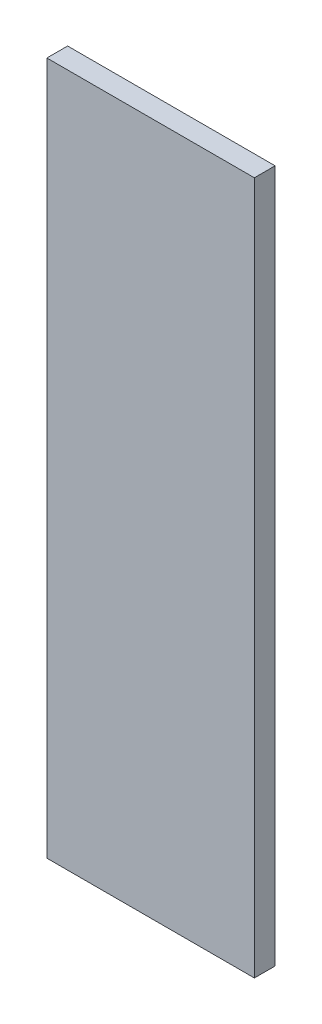
ISO-10303-21;
HEADER;
FILE_DESCRIPTION(('STEP AP214'),'2;1');
FILE_NAME('part.step','',(''),(''),'','','');
FILE_SCHEMA(('AUTOMOTIVE_DESIGN { 1 0 10303 214 1 1 1 1 }'));
ENDSEC;
DATA;
#1=APPLICATION_CONTEXT('core data for automotive mechanical design processes');
#2=APPLICATION_PROTOCOL_DEFINITION('international standard','automotive_design',2000,#1);
#3=PRODUCT_CONTEXT('',#1,'mechanical');
#4=PRODUCT('Part','Part','',(#3));
#5=PRODUCT_RELATED_PRODUCT_CATEGORY('part','',(#4));
#6=PRODUCT_DEFINITION_FORMATION('','',#4);
#7=PRODUCT_DEFINITION_CONTEXT('part definition',#1,'design');
#8=PRODUCT_DEFINITION('design','',#6,#7);
#9=PRODUCT_DEFINITION_SHAPE('','',#8);
#10=(LENGTH_UNIT() NAMED_UNIT(*) SI_UNIT(.MILLI.,.METRE.));
#11=(NAMED_UNIT(*) PLANE_ANGLE_UNIT() SI_UNIT($,.RADIAN.));
#12=(NAMED_UNIT(*) SI_UNIT($,.STERADIAN.) SOLID_ANGLE_UNIT());
#13=UNCERTAINTY_MEASURE_WITH_UNIT(LENGTH_MEASURE(1.E-05),#10,'distance_accuracy_value','');
#14=(GEOMETRIC_REPRESENTATION_CONTEXT(3) GLOBAL_UNCERTAINTY_ASSIGNED_CONTEXT((#13)) GLOBAL_UNIT_ASSIGNED_CONTEXT((#10,
#11,#12)) REPRESENTATION_CONTEXT('',''));
#15=CARTESIAN_POINT('',(0.,0.,0.));
#16=DIRECTION('',(0.,0.,1.));
#17=DIRECTION('',(1.,0.,0.));
#18=AXIS2_PLACEMENT_3D('',#15,#16,#17);
#19=CARTESIAN_POINT('',(0.,0.,5.));
#20=DIRECTION('',(1.,0.,0.));
#21=DIRECTION('',(0.,0.,-1.));
#22=AXIS2_PLACEMENT_3D('',#19,#20,#21);
#23=PLANE('',#22);
#24=DIRECTION('',(0.,-1.,0.));
#25=VECTOR('',#24,1.);
#26=CARTESIAN_POINT('',(0.,0.,0.));
#27=LINE('',#26,#25);
#28=CARTESIAN_POINT('',(0.,167.,0.));
#29=VERTEX_POINT('',#28);
#30=CARTESIAN_POINT('',(0.,0.,0.));
#31=VERTEX_POINT('',#30);
#32=EDGE_CURVE('E96',#29,#31,#27,.T.);
#33=ORIENTED_EDGE('',*,*,#32,.T.);
#34=DIRECTION('',(0.,0.,-1.));
#35=VECTOR('',#34,1.);
#36=CARTESIAN_POINT('',(0.,0.,5.));
#37=LINE('',#36,#35);
#38=CARTESIAN_POINT('',(0.,0.,5.));
#39=VERTEX_POINT('',#38);
#40=EDGE_CURVE('E11',#39,#31,#37,.T.);
#41=ORIENTED_EDGE('',*,*,#40,.F.);
#42=DIRECTION('',(0.,-1.,0.));
#43=VECTOR('',#42,1.);
#44=CARTESIAN_POINT('',(0.,0.,5.));
#45=LINE('',#44,#43);
#46=CARTESIAN_POINT('',(0.,167.,5.));
#47=VERTEX_POINT('',#46);
#48=EDGE_CURVE('E84',#47,#39,#45,.T.);
#49=ORIENTED_EDGE('',*,*,#48,.F.);
#50=DIRECTION('',(0.,0.,-1.));
#51=VECTOR('',#50,1.);
#52=CARTESIAN_POINT('',(0.,167.,5.));
#53=LINE('',#52,#51);
#54=EDGE_CURVE('E92',#47,#29,#53,.T.);
#55=ORIENTED_EDGE('',*,*,#54,.T.);
#56=EDGE_LOOP('',(#33,#41,#49,#55));
#57=FACE_BOUND('',#56,.T.);
#58=ADVANCED_FACE('F33',(#57),#23,.F.);
#59=CARTESIAN_POINT('',(0.,0.,5.));
#60=DIRECTION('',(0.,1.,0.));
#61=DIRECTION('',(0.,0.,1.));
#62=AXIS2_PLACEMENT_3D('',#59,#60,#61);
#63=PLANE('',#62);
#64=DIRECTION('',(1.,0.,0.));
#65=VECTOR('',#64,1.);
#66=CARTESIAN_POINT('',(0.,0.,0.));
#67=LINE('',#66,#65);
#68=CARTESIAN_POINT('',(50.,0.,0.));
#69=VERTEX_POINT('',#68);
#70=EDGE_CURVE('E88',#31,#69,#67,.T.);
#71=ORIENTED_EDGE('',*,*,#70,.T.);
#72=DIRECTION('',(0.,0.,-1.));
#73=VECTOR('',#72,1.);
#74=CARTESIAN_POINT('',(50.,0.,5.));
#75=LINE('',#74,#73);
#76=CARTESIAN_POINT('',(50.,0.,5.));
#77=VERTEX_POINT('',#76);
#78=EDGE_CURVE('E41',#77,#69,#75,.T.);
#79=ORIENTED_EDGE('',*,*,#78,.F.);
#80=DIRECTION('',(1.,0.,0.));
#81=VECTOR('',#80,1.);
#82=CARTESIAN_POINT('',(0.,0.,5.));
#83=LINE('',#82,#81);
#84=EDGE_CURVE('E79',#39,#77,#83,.T.);
#85=ORIENTED_EDGE('',*,*,#84,.F.);
#86=ORIENTED_EDGE('',*,*,#40,.T.);
#87=EDGE_LOOP('',(#71,#79,#85,#86));
#88=FACE_BOUND('',#87,.T.);
#89=ADVANCED_FACE('F87',(#88),#63,.F.);
#90=CARTESIAN_POINT('',(50.,0.,5.));
#91=DIRECTION('',(-1.,0.,0.));
#92=DIRECTION('',(0.,0.,1.));
#93=AXIS2_PLACEMENT_3D('',#90,#91,#92);
#94=PLANE('',#93);
#95=DIRECTION('',(0.,1.,0.));
#96=VECTOR('',#95,1.);
#97=CARTESIAN_POINT('',(50.,0.,0.));
#98=LINE('',#97,#96);
#99=CARTESIAN_POINT('',(50.,167.,0.));
#100=VERTEX_POINT('',#99);
#101=EDGE_CURVE('E66',#69,#100,#98,.T.);
#102=ORIENTED_EDGE('',*,*,#101,.T.);
#103=DIRECTION('',(0.,0.,-1.));
#104=VECTOR('',#103,1.);
#105=CARTESIAN_POINT('',(50.,167.,5.));
#106=LINE('',#105,#104);
#107=CARTESIAN_POINT('',(50.,167.,5.));
#108=VERTEX_POINT('',#107);
#109=EDGE_CURVE('E89',#108,#100,#106,.T.);
#110=ORIENTED_EDGE('',*,*,#109,.F.);
#111=DIRECTION('',(0.,1.,0.));
#112=VECTOR('',#111,1.);
#113=CARTESIAN_POINT('',(50.,0.,5.));
#114=LINE('',#113,#112);
#115=EDGE_CURVE('E82',#77,#108,#114,.T.);
#116=ORIENTED_EDGE('',*,*,#115,.F.);
#117=ORIENTED_EDGE('',*,*,#78,.T.);
#118=EDGE_LOOP('',(#102,#110,#116,#117));
#119=FACE_BOUND('',#118,.T.);
#120=ADVANCED_FACE('F90',(#119),#94,.F.);
#121=CARTESIAN_POINT('',(0.,167.,5.));
#122=DIRECTION('',(0.,-1.,0.));
#123=DIRECTION('',(0.,0.,-1.));
#124=AXIS2_PLACEMENT_3D('',#121,#122,#123);
#125=PLANE('',#124);
#126=DIRECTION('',(-1.,0.,0.));
#127=VECTOR('',#126,1.);
#128=CARTESIAN_POINT('',(0.,167.,0.));
#129=LINE('',#128,#127);
#130=EDGE_CURVE('E72',#100,#29,#129,.T.);
#131=ORIENTED_EDGE('',*,*,#130,.T.);
#132=ORIENTED_EDGE('',*,*,#54,.F.);
#133=DIRECTION('',(-1.,0.,0.));
#134=VECTOR('',#133,1.);
#135=CARTESIAN_POINT('',(0.,167.,5.));
#136=LINE('',#135,#134);
#137=EDGE_CURVE('E49',#108,#47,#136,.T.);
#138=ORIENTED_EDGE('',*,*,#137,.F.);
#139=ORIENTED_EDGE('',*,*,#109,.T.);
#140=EDGE_LOOP('',(#131,#132,#138,#139));
#141=FACE_BOUND('',#140,.T.);
#142=ADVANCED_FACE('F103',(#141),#125,.F.);
#143=CARTESIAN_POINT('',(0.,0.,5.));
#144=DIRECTION('',(0.,0.,-1.));
#145=DIRECTION('',(-1.,0.,0.));
#146=AXIS2_PLACEMENT_3D('',#143,#144,#145);
#147=PLANE('',#146);
#148=ORIENTED_EDGE('',*,*,#48,.T.);
#149=ORIENTED_EDGE('',*,*,#84,.T.);
#150=ORIENTED_EDGE('',*,*,#115,.T.);
#151=ORIENTED_EDGE('',*,*,#137,.T.);
#152=EDGE_LOOP('',(#148,#149,#150,#151));
#153=FACE_BOUND('',#152,.T.);
#154=ADVANCED_FACE('F80',(#153),#147,.F.);
#155=CARTESIAN_POINT('',(0.,0.,0.));
#156=DIRECTION('',(0.,0.,-1.));
#157=DIRECTION('',(-1.,0.,0.));
#158=AXIS2_PLACEMENT_3D('',#155,#156,#157);
#159=PLANE('',#158);
#160=ORIENTED_EDGE('',*,*,#32,.F.);
#161=ORIENTED_EDGE('',*,*,#130,.F.);
#162=ORIENTED_EDGE('',*,*,#101,.F.);
#163=ORIENTED_EDGE('',*,*,#70,.F.);
#164=EDGE_LOOP('',(#160,#161,#162,#163));
#165=FACE_BOUND('',#164,.T.);
#166=ADVANCED_FACE('F106',(#165),#159,.T.);
#167=CLOSED_SHELL('',(#58,#89,#120,#142,#154,#166));
#168=MANIFOLD_SOLID_BREP('B2',#167);
#169=ADVANCED_BREP_SHAPE_REPRESENTATION('',(#18,#168),#14);
#170=SHAPE_DEFINITION_REPRESENTATION(#9,#169);
ENDSEC;
END-ISO-10303-21;
